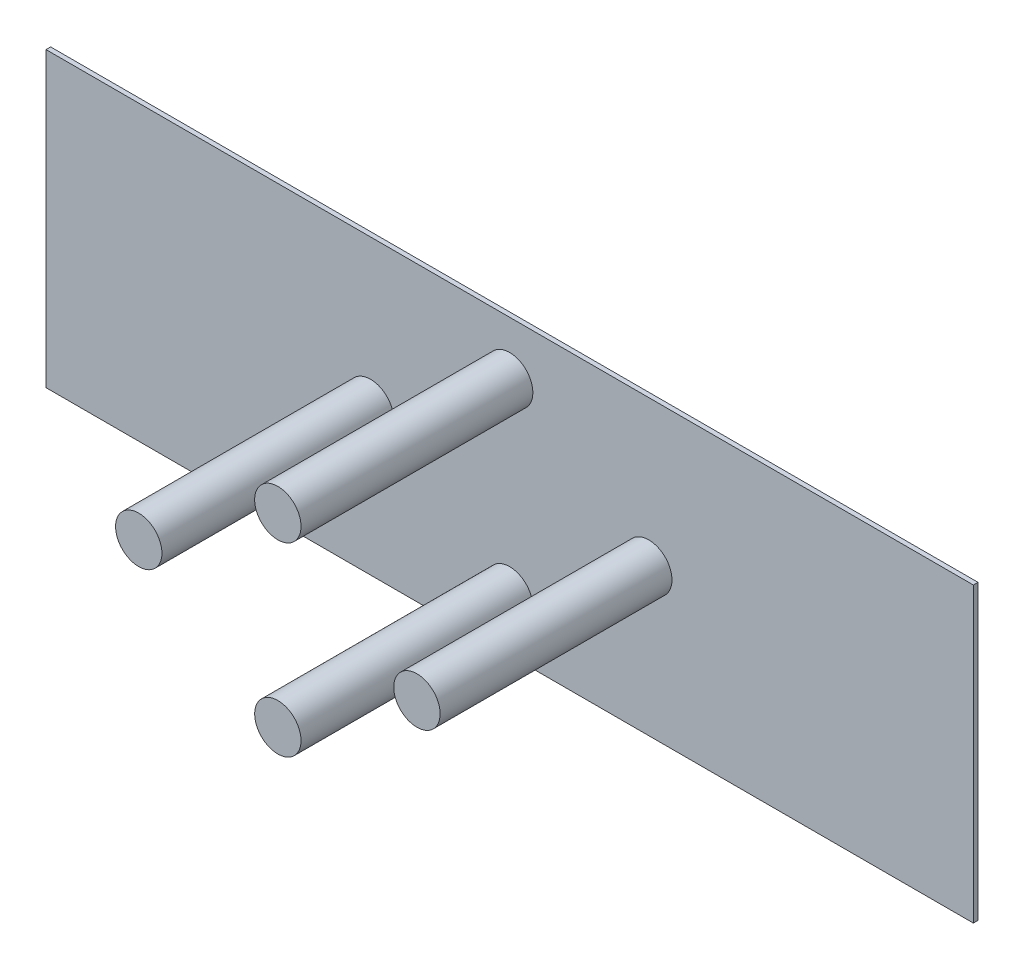
ISO-10303-21;
HEADER;
FILE_DESCRIPTION(('STEP AP214'),'2;1');
FILE_NAME('part.step','',(''),(''),'','','');
FILE_SCHEMA(('AUTOMOTIVE_DESIGN { 1 0 10303 214 1 1 1 1 }'));
ENDSEC;
DATA;
#1=APPLICATION_CONTEXT('core data for automotive mechanical design processes');
#2=APPLICATION_PROTOCOL_DEFINITION('international standard','automotive_design',2000,#1);
#3=PRODUCT_CONTEXT('',#1,'mechanical');
#4=PRODUCT('Part','Part','',(#3));
#5=PRODUCT_RELATED_PRODUCT_CATEGORY('part','',(#4));
#6=PRODUCT_DEFINITION_FORMATION('','',#4);
#7=PRODUCT_DEFINITION_CONTEXT('part definition',#1,'design');
#8=PRODUCT_DEFINITION('design','',#6,#7);
#9=PRODUCT_DEFINITION_SHAPE('','',#8);
#10=(LENGTH_UNIT() NAMED_UNIT(*) SI_UNIT(.MILLI.,.METRE.));
#11=(NAMED_UNIT(*) PLANE_ANGLE_UNIT() SI_UNIT($,.RADIAN.));
#12=(NAMED_UNIT(*) SI_UNIT($,.STERADIAN.) SOLID_ANGLE_UNIT());
#13=UNCERTAINTY_MEASURE_WITH_UNIT(LENGTH_MEASURE(1.E-05),#10,'distance_accuracy_value','');
#14=(GEOMETRIC_REPRESENTATION_CONTEXT(3) GLOBAL_UNCERTAINTY_ASSIGNED_CONTEXT((#13)) GLOBAL_UNIT_ASSIGNED_CONTEXT((#10,
#11,#12)) REPRESENTATION_CONTEXT('',''));
#15=CARTESIAN_POINT('',(0.,0.,0.));
#16=DIRECTION('',(0.,0.,1.));
#17=DIRECTION('',(1.,0.,0.));
#18=AXIS2_PLACEMENT_3D('',#15,#16,#17);
#19=CARTESIAN_POINT('',(15000.,3157.54295769406,-100.));
#20=DIRECTION('',(1.,0.,0.));
#21=DIRECTION('',(0.,0.,-1.));
#22=AXIS2_PLACEMENT_3D('',#19,#20,#21);
#23=PLANE('',#22);
#24=DIRECTION('',(0.,1.,0.));
#25=VECTOR('',#24,1.);
#26=CARTESIAN_POINT('',(15000.,3157.54295769406,0.));
#27=LINE('',#26,#25);
#28=CARTESIAN_POINT('',(15000.,-3157.54295769405,0.));
#29=VERTEX_POINT('',#28);
#30=CARTESIAN_POINT('',(15000.,3157.54295769406,0.));
#31=VERTEX_POINT('',#30);
#32=EDGE_CURVE('E110',#29,#31,#27,.T.);
#33=ORIENTED_EDGE('',*,*,#32,.F.);
#34=DIRECTION('',(0.,0.,1.));
#35=VECTOR('',#34,1.);
#36=CARTESIAN_POINT('',(15000.,-3157.54295769405,-100.));
#37=LINE('',#36,#35);
#38=CARTESIAN_POINT('',(15000.,-3157.54295769405,-100.));
#39=VERTEX_POINT('',#38);
#40=EDGE_CURVE('E11',#39,#29,#37,.T.);
#41=ORIENTED_EDGE('',*,*,#40,.F.);
#42=DIRECTION('',(0.,1.,0.));
#43=VECTOR('',#42,1.);
#44=CARTESIAN_POINT('',(15000.,3157.54295769406,-100.));
#45=LINE('',#44,#43);
#46=CARTESIAN_POINT('',(15000.,3157.54295769406,-100.));
#47=VERTEX_POINT('',#46);
#48=EDGE_CURVE('E101',#39,#47,#45,.T.);
#49=ORIENTED_EDGE('',*,*,#48,.T.);
#50=DIRECTION('',(0.,0.,1.));
#51=VECTOR('',#50,1.);
#52=CARTESIAN_POINT('',(15000.,3157.54295769406,-100.));
#53=LINE('',#52,#51);
#54=EDGE_CURVE('E42',#47,#31,#53,.T.);
#55=ORIENTED_EDGE('',*,*,#54,.T.);
#56=EDGE_LOOP('',(#33,#41,#49,#55));
#57=FACE_BOUND('',#56,.T.);
#58=ADVANCED_FACE('F39',(#57),#23,.T.);
#59=CARTESIAN_POINT('',(-5000.,-3157.54295769405,-100.));
#60=DIRECTION('',(0.,-1.,0.));
#61=DIRECTION('',(0.,0.,-1.));
#62=AXIS2_PLACEMENT_3D('',#59,#60,#61);
#63=PLANE('',#62);
#64=DIRECTION('',(1.,0.,0.));
#65=VECTOR('',#64,1.);
#66=CARTESIAN_POINT('',(-5000.,-3157.54295769405,0.));
#67=LINE('',#66,#65);
#68=CARTESIAN_POINT('',(-5000.,-3157.54295769405,0.));
#69=VERTEX_POINT('',#68);
#70=EDGE_CURVE('E104',#69,#29,#67,.T.);
#71=ORIENTED_EDGE('',*,*,#70,.F.);
#72=DIRECTION('',(0.,0.,1.));
#73=VECTOR('',#72,1.);
#74=CARTESIAN_POINT('',(-5000.,-3157.54295769405,-100.));
#75=LINE('',#74,#73);
#76=CARTESIAN_POINT('',(-5000.,-3157.54295769405,-100.));
#77=VERTEX_POINT('',#76);
#78=EDGE_CURVE('E49',#77,#69,#75,.T.);
#79=ORIENTED_EDGE('',*,*,#78,.F.);
#80=DIRECTION('',(1.,0.,0.));
#81=VECTOR('',#80,1.);
#82=CARTESIAN_POINT('',(-5000.,-3157.54295769405,-100.));
#83=LINE('',#82,#81);
#84=EDGE_CURVE('E96',#77,#39,#83,.T.);
#85=ORIENTED_EDGE('',*,*,#84,.T.);
#86=ORIENTED_EDGE('',*,*,#40,.T.);
#87=EDGE_LOOP('',(#71,#79,#85,#86));
#88=FACE_BOUND('',#87,.T.);
#89=ADVANCED_FACE('F127',(#88),#63,.T.);
#90=CARTESIAN_POINT('',(-5000.,3157.54295769405,-100.));
#91=DIRECTION('',(-1.,0.,0.));
#92=DIRECTION('',(0.,0.,1.));
#93=AXIS2_PLACEMENT_3D('',#90,#91,#92);
#94=PLANE('',#93);
#95=DIRECTION('',(0.,-1.,0.));
#96=VECTOR('',#95,1.);
#97=CARTESIAN_POINT('',(-5000.,3157.54295769405,0.));
#98=LINE('',#97,#96);
#99=CARTESIAN_POINT('',(-5000.,3157.54295769405,0.));
#100=VERTEX_POINT('',#99);
#101=EDGE_CURVE('E90',#100,#69,#98,.T.);
#102=ORIENTED_EDGE('',*,*,#101,.F.);
#103=DIRECTION('',(0.,0.,1.));
#104=VECTOR('',#103,1.);
#105=CARTESIAN_POINT('',(-5000.,3157.54295769405,-100.));
#106=LINE('',#105,#104);
#107=CARTESIAN_POINT('',(-5000.,3157.54295769405,-100.));
#108=VERTEX_POINT('',#107);
#109=EDGE_CURVE('E85',#108,#100,#106,.T.);
#110=ORIENTED_EDGE('',*,*,#109,.F.);
#111=DIRECTION('',(0.,-1.,0.));
#112=VECTOR('',#111,1.);
#113=CARTESIAN_POINT('',(-5000.,3157.54295769405,-100.));
#114=LINE('',#113,#112);
#115=EDGE_CURVE('E88',#108,#77,#114,.T.);
#116=ORIENTED_EDGE('',*,*,#115,.T.);
#117=ORIENTED_EDGE('',*,*,#78,.T.);
#118=EDGE_LOOP('',(#102,#110,#116,#117));
#119=FACE_BOUND('',#118,.T.);
#120=ADVANCED_FACE('F87',(#119),#94,.T.);
#121=CARTESIAN_POINT('',(-5000.,3157.54295769405,-100.));
#122=DIRECTION('',(0.,1.,0.));
#123=DIRECTION('',(-1.,0.,0.));
#124=AXIS2_PLACEMENT_3D('',#121,#122,#123);
#125=PLANE('',#124);
#126=DIRECTION('',(-1.,0.,0.));
#127=VECTOR('',#126,1.);
#128=CARTESIAN_POINT('',(-5000.,3157.54295769405,0.));
#129=LINE('',#128,#127);
#130=EDGE_CURVE('E114',#31,#100,#129,.T.);
#131=ORIENTED_EDGE('',*,*,#130,.F.);
#132=ORIENTED_EDGE('',*,*,#54,.F.);
#133=DIRECTION('',(-1.,0.,0.));
#134=VECTOR('',#133,1.);
#135=CARTESIAN_POINT('',(-5000.,3157.54295769405,-100.));
#136=LINE('',#135,#134);
#137=EDGE_CURVE('E95',#47,#108,#136,.T.);
#138=ORIENTED_EDGE('',*,*,#137,.T.);
#139=ORIENTED_EDGE('',*,*,#109,.T.);
#140=EDGE_LOOP('',(#131,#132,#138,#139));
#141=FACE_BOUND('',#140,.T.);
#142=ADVANCED_FACE('F99',(#141),#125,.T.);
#143=CARTESIAN_POINT('',(0.,0.,-100.));
#144=DIRECTION('',(0.,0.,1.));
#145=DIRECTION('',(1.,0.,0.));
#146=AXIS2_PLACEMENT_3D('',#143,#144,#145);
#147=PLANE('',#146);
#148=ORIENTED_EDGE('',*,*,#48,.F.);
#149=ORIENTED_EDGE('',*,*,#84,.F.);
#150=ORIENTED_EDGE('',*,*,#115,.F.);
#151=ORIENTED_EDGE('',*,*,#137,.F.);
#152=EDGE_LOOP('',(#148,#149,#150,#151));
#153=FACE_BOUND('',#152,.T.);
#154=ADVANCED_FACE('F94',(#153),#147,.F.);
#155=CARTESIAN_POINT('',(0.,0.,0.));
#156=DIRECTION('',(0.,0.,1.));
#157=DIRECTION('',(1.,0.,0.));
#158=AXIS2_PLACEMENT_3D('',#155,#156,#157);
#159=PLANE('',#158);
#160=CARTESIAN_POINT('',(5000.,-2000.,0.));
#161=DIRECTION('',(0.,0.,1.));
#162=DIRECTION('',(-1.,0.,0.));
#163=AXIS2_PLACEMENT_3D('',#160,#161,#162);
#164=CIRCLE('',#163,500.);
#165=CARTESIAN_POINT('',(4500.,-2000.,0.));
#166=VERTEX_POINT('',#165);
#167=EDGE_CURVE('E184',#166,#166,#164,.T.);
#168=ORIENTED_EDGE('',*,*,#167,.F.);
#169=EDGE_LOOP('',(#168));
#170=FACE_BOUND('',#169,.T.);
#171=CARTESIAN_POINT('',(5000.,2000.,0.));
#172=DIRECTION('',(0.,0.,1.));
#173=DIRECTION('',(1.,0.,0.));
#174=AXIS2_PLACEMENT_3D('',#171,#172,#173);
#175=CIRCLE('',#174,500.);
#176=CARTESIAN_POINT('',(5500.,2000.,0.));
#177=VERTEX_POINT('',#176);
#178=EDGE_CURVE('E183',#177,#177,#175,.T.);
#179=ORIENTED_EDGE('',*,*,#178,.F.);
#180=EDGE_LOOP('',(#179));
#181=FACE_BOUND('',#180,.T.);
#182=CARTESIAN_POINT('',(8000.,0.,0.));
#183=DIRECTION('',(0.,0.,1.));
#184=DIRECTION('',(1.,0.,0.));
#185=AXIS2_PLACEMENT_3D('',#182,#183,#184);
#186=CIRCLE('',#185,500.);
#187=CARTESIAN_POINT('',(8500.,0.,0.));
#188=VERTEX_POINT('',#187);
#189=EDGE_CURVE('E196',#188,#188,#186,.T.);
#190=ORIENTED_EDGE('',*,*,#189,.F.);
#191=EDGE_LOOP('',(#190));
#192=FACE_BOUND('',#191,.T.);
#193=CARTESIAN_POINT('',(2000.,0.,0.));
#194=DIRECTION('',(0.,0.,1.));
#195=DIRECTION('',(1.,0.,0.));
#196=AXIS2_PLACEMENT_3D('',#193,#194,#195);
#197=CIRCLE('',#196,500.);
#198=CARTESIAN_POINT('',(2500.,0.,0.));
#199=VERTEX_POINT('',#198);
#200=EDGE_CURVE('E202',#199,#199,#197,.T.);
#201=ORIENTED_EDGE('',*,*,#200,.F.);
#202=EDGE_LOOP('',(#201));
#203=FACE_BOUND('',#202,.T.);
#204=ORIENTED_EDGE('',*,*,#32,.T.);
#205=ORIENTED_EDGE('',*,*,#130,.T.);
#206=ORIENTED_EDGE('',*,*,#101,.T.);
#207=ORIENTED_EDGE('',*,*,#70,.T.);
#208=EDGE_LOOP('',(#204,#205,#206,#207));
#209=FACE_BOUND('',#208,.T.);
#210=ADVANCED_FACE('F126',(#170,#181,#192,#203,#209),#159,.T.);
#211=CARTESIAN_POINT('',(2000.,0.,5000.));
#212=DIRECTION('',(0.,0.,-1.));
#213=DIRECTION('',(-1.,0.,0.));
#214=AXIS2_PLACEMENT_3D('',#211,#212,#213);
#215=CYLINDRICAL_SURFACE('',#214,500.);
#216=CARTESIAN_POINT('',(2000.,0.,5000.));
#217=DIRECTION('',(0.,0.,1.));
#218=DIRECTION('',(1.,0.,0.));
#219=AXIS2_PLACEMENT_3D('',#216,#217,#218);
#220=CIRCLE('',#219,500.);
#221=CARTESIAN_POINT('',(2500.,0.,5000.));
#222=VERTEX_POINT('',#221);
#223=EDGE_CURVE('E115',#222,#222,#220,.T.);
#224=ORIENTED_EDGE('',*,*,#223,.F.);
#225=EDGE_LOOP('',(#224));
#226=FACE_BOUND('',#225,.T.);
#227=ORIENTED_EDGE('',*,*,#200,.T.);
#228=EDGE_LOOP('',(#227));
#229=FACE_BOUND('',#228,.T.);
#230=ADVANCED_FACE('F144',(#226,#229),#215,.T.);
#231=CARTESIAN_POINT('',(2000.,0.,5000.));
#232=DIRECTION('',(0.,0.,1.));
#233=DIRECTION('',(1.,0.,0.));
#234=AXIS2_PLACEMENT_3D('',#231,#232,#233);
#235=PLANE('',#234);
#236=ORIENTED_EDGE('',*,*,#223,.T.);
#237=EDGE_LOOP('',(#236));
#238=FACE_BOUND('',#237,.T.);
#239=ADVANCED_FACE('F149',(#238),#235,.T.);
#240=CARTESIAN_POINT('',(8000.,0.,5000.));
#241=DIRECTION('',(0.,0.,-1.));
#242=DIRECTION('',(-1.,0.,0.));
#243=AXIS2_PLACEMENT_3D('',#240,#241,#242);
#244=CYLINDRICAL_SURFACE('',#243,500.);
#245=CARTESIAN_POINT('',(8000.,0.,5000.));
#246=DIRECTION('',(0.,0.,1.));
#247=DIRECTION('',(1.,0.,0.));
#248=AXIS2_PLACEMENT_3D('',#245,#246,#247);
#249=CIRCLE('',#248,500.);
#250=CARTESIAN_POINT('',(8500.,0.,5000.));
#251=VERTEX_POINT('',#250);
#252=EDGE_CURVE('E198',#251,#251,#249,.T.);
#253=ORIENTED_EDGE('',*,*,#252,.F.);
#254=EDGE_LOOP('',(#253));
#255=FACE_BOUND('',#254,.T.);
#256=ORIENTED_EDGE('',*,*,#189,.T.);
#257=EDGE_LOOP('',(#256));
#258=FACE_BOUND('',#257,.T.);
#259=ADVANCED_FACE('F153',(#255,#258),#244,.T.);
#260=CARTESIAN_POINT('',(8000.,0.,5000.));
#261=DIRECTION('',(0.,0.,1.));
#262=DIRECTION('',(1.,0.,0.));
#263=AXIS2_PLACEMENT_3D('',#260,#261,#262);
#264=PLANE('',#263);
#265=ORIENTED_EDGE('',*,*,#252,.T.);
#266=EDGE_LOOP('',(#265));
#267=FACE_BOUND('',#266,.T.);
#268=ADVANCED_FACE('F157',(#267),#264,.T.);
#269=CARTESIAN_POINT('',(5000.,2000.,5000.));
#270=DIRECTION('',(0.,0.,-1.));
#271=DIRECTION('',(-1.,0.,0.));
#272=AXIS2_PLACEMENT_3D('',#269,#270,#271);
#273=CYLINDRICAL_SURFACE('',#272,500.);
#274=CARTESIAN_POINT('',(5000.,2000.,5000.));
#275=DIRECTION('',(0.,0.,1.));
#276=DIRECTION('',(1.,0.,0.));
#277=AXIS2_PLACEMENT_3D('',#274,#275,#276);
#278=CIRCLE('',#277,500.);
#279=CARTESIAN_POINT('',(5500.,2000.,5000.));
#280=VERTEX_POINT('',#279);
#281=EDGE_CURVE('E189',#280,#280,#278,.T.);
#282=ORIENTED_EDGE('',*,*,#281,.F.);
#283=EDGE_LOOP('',(#282));
#284=FACE_BOUND('',#283,.T.);
#285=ORIENTED_EDGE('',*,*,#178,.T.);
#286=EDGE_LOOP('',(#285));
#287=FACE_BOUND('',#286,.T.);
#288=ADVANCED_FACE('F161',(#284,#287),#273,.T.);
#289=CARTESIAN_POINT('',(5000.,2000.,5000.));
#290=DIRECTION('',(0.,0.,1.));
#291=DIRECTION('',(1.,0.,0.));
#292=AXIS2_PLACEMENT_3D('',#289,#290,#291);
#293=PLANE('',#292);
#294=ORIENTED_EDGE('',*,*,#281,.T.);
#295=EDGE_LOOP('',(#294));
#296=FACE_BOUND('',#295,.T.);
#297=ADVANCED_FACE('F165',(#296),#293,.T.);
#298=CARTESIAN_POINT('',(5000.,-2000.,5000.));
#299=DIRECTION('',(0.,0.,-1.));
#300=DIRECTION('',(-1.,0.,0.));
#301=AXIS2_PLACEMENT_3D('',#298,#299,#300);
#302=CYLINDRICAL_SURFACE('',#301,500.);
#303=CARTESIAN_POINT('',(5000.,-2000.,5000.));
#304=DIRECTION('',(0.,0.,1.));
#305=DIRECTION('',(-1.,0.,0.));
#306=AXIS2_PLACEMENT_3D('',#303,#304,#305);
#307=CIRCLE('',#306,500.);
#308=CARTESIAN_POINT('',(4500.,-2000.,5000.));
#309=VERTEX_POINT('',#308);
#310=EDGE_CURVE('E181',#309,#309,#307,.T.);
#311=ORIENTED_EDGE('',*,*,#310,.F.);
#312=EDGE_LOOP('',(#311));
#313=FACE_BOUND('',#312,.T.);
#314=ORIENTED_EDGE('',*,*,#167,.T.);
#315=EDGE_LOOP('',(#314));
#316=FACE_BOUND('',#315,.T.);
#317=ADVANCED_FACE('F169',(#313,#316),#302,.T.);
#318=CARTESIAN_POINT('',(5000.,-2000.,5000.));
#319=DIRECTION('',(0.,0.,-1.));
#320=DIRECTION('',(-1.,0.,0.));
#321=AXIS2_PLACEMENT_3D('',#318,#319,#320);
#322=PLANE('',#321);
#323=ORIENTED_EDGE('',*,*,#310,.T.);
#324=EDGE_LOOP('',(#323));
#325=FACE_BOUND('',#324,.T.);
#326=ADVANCED_FACE('F173',(#325),#322,.F.);
#327=CLOSED_SHELL('',(#58,#89,#120,#142,#154,#210,#230,#239,#259,#268,#288,#297,#317,#326));
#328=MANIFOLD_SOLID_BREP('B2',#327);
#329=ADVANCED_BREP_SHAPE_REPRESENTATION('',(#18,#328),#14);
#330=SHAPE_DEFINITION_REPRESENTATION(#9,#329);
ENDSEC;
END-ISO-10303-21;
